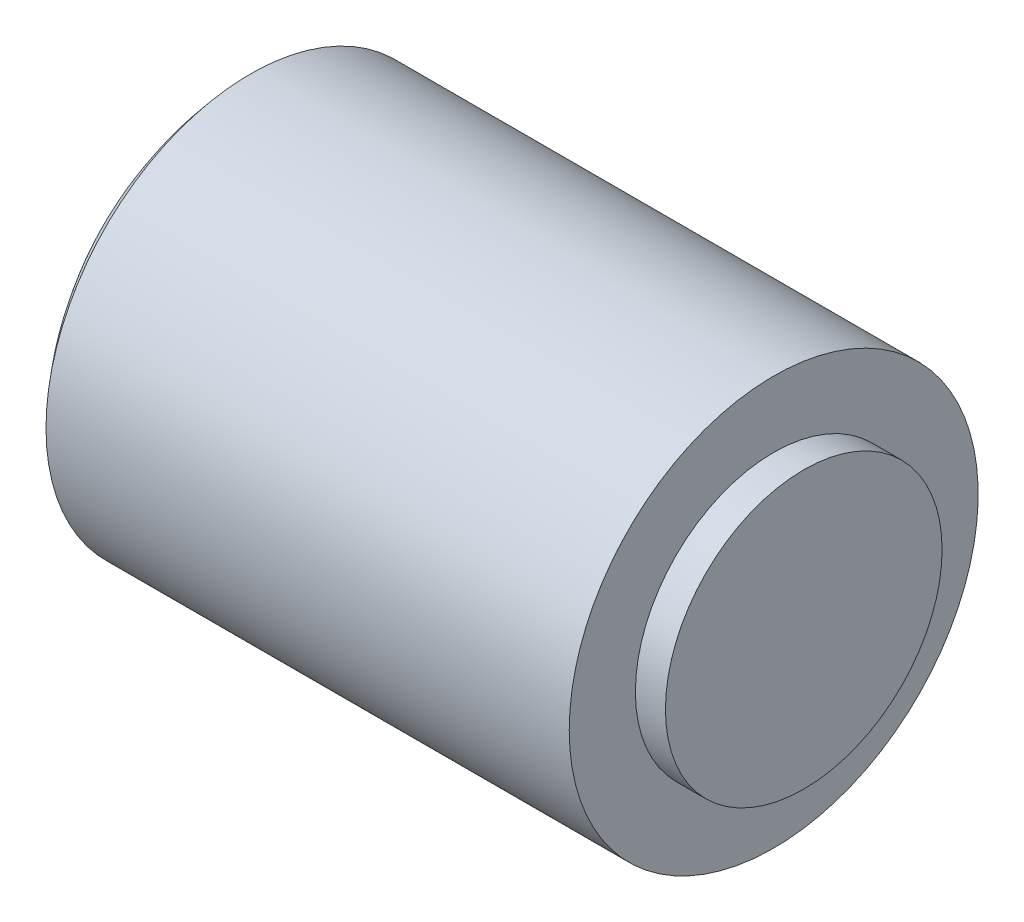
ISO-10303-21;
HEADER;
FILE_DESCRIPTION(('STEP AP214'),'2;1');
FILE_NAME('part.step','',(''),(''),'','','');
FILE_SCHEMA(('AUTOMOTIVE_DESIGN { 1 0 10303 214 1 1 1 1 }'));
ENDSEC;
DATA;
#1=APPLICATION_CONTEXT('core data for automotive mechanical design processes');
#2=APPLICATION_PROTOCOL_DEFINITION('international standard','automotive_design',2000,#1);
#3=PRODUCT_CONTEXT('',#1,'mechanical');
#4=PRODUCT('Part','Part','',(#3));
#5=PRODUCT_RELATED_PRODUCT_CATEGORY('part','',(#4));
#6=PRODUCT_DEFINITION_FORMATION('','',#4);
#7=PRODUCT_DEFINITION_CONTEXT('part definition',#1,'design');
#8=PRODUCT_DEFINITION('design','',#6,#7);
#9=PRODUCT_DEFINITION_SHAPE('','',#8);
#10=(LENGTH_UNIT() NAMED_UNIT(*) SI_UNIT(.MILLI.,.METRE.));
#11=(NAMED_UNIT(*) PLANE_ANGLE_UNIT() SI_UNIT($,.RADIAN.));
#12=(NAMED_UNIT(*) SI_UNIT($,.STERADIAN.) SOLID_ANGLE_UNIT());
#13=UNCERTAINTY_MEASURE_WITH_UNIT(LENGTH_MEASURE(1.E-05),#10,'distance_accuracy_value','');
#14=(GEOMETRIC_REPRESENTATION_CONTEXT(3) GLOBAL_UNCERTAINTY_ASSIGNED_CONTEXT((#13)) GLOBAL_UNIT_ASSIGNED_CONTEXT((#10,
#11,#12)) REPRESENTATION_CONTEXT('',''));
#15=CARTESIAN_POINT('',(0.,0.,0.));
#16=DIRECTION('',(0.,0.,1.));
#17=DIRECTION('',(1.,0.,0.));
#18=AXIS2_PLACEMENT_3D('',#15,#16,#17);
#19=CARTESIAN_POINT('',(37.9615384615385,0.,0.));
#20=DIRECTION('',(-1.,0.,0.));
#21=DIRECTION('',(0.,0.,-1.));
#22=AXIS2_PLACEMENT_3D('',#19,#20,#21);
#23=SPHERICAL_SURFACE('',#22,50.9615384615385);
#24=CARTESIAN_POINT('',(0.,0.,0.));
#25=DIRECTION('',(-1.,0.,0.));
#26=DIRECTION('',(0.,0.,1.));
#27=AXIS2_PLACEMENT_3D('',#24,#25,#26);
#28=CIRCLE('',#27,34.);
#29=CARTESIAN_POINT('',(0.,0.,34.));
#30=VERTEX_POINT('',#29);
#31=EDGE_CURVE('E10',#30,#30,#28,.T.);
#32=ORIENTED_EDGE('',*,*,#31,.T.);
#33=EDGE_LOOP('',(#32));
#34=FACE_BOUND('',#33,.T.);
#35=ADVANCED_FACE('F30',(#34),#23,.T.);
#36=CARTESIAN_POINT('',(0.,0.,0.));
#37=DIRECTION('',(-1.,0.,0.));
#38=DIRECTION('',(0.,0.,1.));
#39=AXIS2_PLACEMENT_3D('',#36,#37,#38);
#40=CYLINDRICAL_SURFACE('',#39,34.);
#41=ORIENTED_EDGE('',*,*,#31,.F.);
#42=EDGE_LOOP('',(#41));
#43=FACE_BOUND('',#42,.T.);
#44=CARTESIAN_POINT('',(87.,0.,0.));
#45=DIRECTION('',(-1.,0.,0.));
#46=DIRECTION('',(0.,0.,1.));
#47=AXIS2_PLACEMENT_3D('',#44,#45,#46);
#48=CIRCLE('',#47,34.);
#49=CARTESIAN_POINT('',(87.,0.,34.));
#50=VERTEX_POINT('',#49);
#51=EDGE_CURVE('E36',#50,#50,#48,.T.);
#52=ORIENTED_EDGE('',*,*,#51,.T.);
#53=EDGE_LOOP('',(#52));
#54=FACE_BOUND('',#53,.T.);
#55=ADVANCED_FACE('F62',(#43,#54),#40,.T.);
#56=CARTESIAN_POINT('',(87.,0.,-34.));
#57=DIRECTION('',(-1.,0.,0.));
#58=DIRECTION('',(0.,0.,1.));
#59=AXIS2_PLACEMENT_3D('',#56,#57,#58);
#60=PLANE('',#59);
#61=ORIENTED_EDGE('',*,*,#51,.F.);
#62=EDGE_LOOP('',(#61));
#63=FACE_BOUND('',#62,.T.);
#64=CARTESIAN_POINT('',(87.,0.,0.));
#65=DIRECTION('',(-1.,0.,0.));
#66=DIRECTION('',(0.,0.,1.));
#67=AXIS2_PLACEMENT_3D('',#64,#65,#66);
#68=CIRCLE('',#67,23.);
#69=CARTESIAN_POINT('',(87.,0.,23.));
#70=VERTEX_POINT('',#69);
#71=EDGE_CURVE('E40',#70,#70,#68,.T.);
#72=ORIENTED_EDGE('',*,*,#71,.T.);
#73=EDGE_LOOP('',(#72));
#74=FACE_BOUND('',#73,.T.);
#75=ADVANCED_FACE('F58',(#63,#74),#60,.F.);
#76=CARTESIAN_POINT('',(0.,0.,0.));
#77=DIRECTION('',(-1.,0.,0.));
#78=DIRECTION('',(0.,0.,1.));
#79=AXIS2_PLACEMENT_3D('',#76,#77,#78);
#80=CYLINDRICAL_SURFACE('',#79,23.);
#81=ORIENTED_EDGE('',*,*,#71,.F.);
#82=EDGE_LOOP('',(#81));
#83=FACE_BOUND('',#82,.T.);
#84=CARTESIAN_POINT('',(92.,0.,0.));
#85=DIRECTION('',(-1.,0.,0.));
#86=DIRECTION('',(0.,0.,1.));
#87=AXIS2_PLACEMENT_3D('',#84,#85,#86);
#88=CIRCLE('',#87,23.);
#89=CARTESIAN_POINT('',(92.,0.,23.));
#90=VERTEX_POINT('',#89);
#91=EDGE_CURVE('E44',#90,#90,#88,.T.);
#92=ORIENTED_EDGE('',*,*,#91,.T.);
#93=EDGE_LOOP('',(#92));
#94=FACE_BOUND('',#93,.T.);
#95=ADVANCED_FACE('F50',(#83,#94),#80,.T.);
#96=CARTESIAN_POINT('',(92.,0.,-23.));
#97=DIRECTION('',(-1.,0.,0.));
#98=DIRECTION('',(0.,0.,1.));
#99=AXIS2_PLACEMENT_3D('',#96,#97,#98);
#100=PLANE('',#99);
#101=ORIENTED_EDGE('',*,*,#91,.F.);
#102=EDGE_LOOP('',(#101));
#103=FACE_BOUND('',#102,.T.);
#104=ADVANCED_FACE('F52',(#103),#100,.F.);
#105=CLOSED_SHELL('',(#35,#55,#75,#95,#104));
#106=MANIFOLD_SOLID_BREP('B2',#105);
#107=ADVANCED_BREP_SHAPE_REPRESENTATION('',(#18,#106),#14);
#108=SHAPE_DEFINITION_REPRESENTATION(#9,#107);
ENDSEC;
END-ISO-10303-21;
